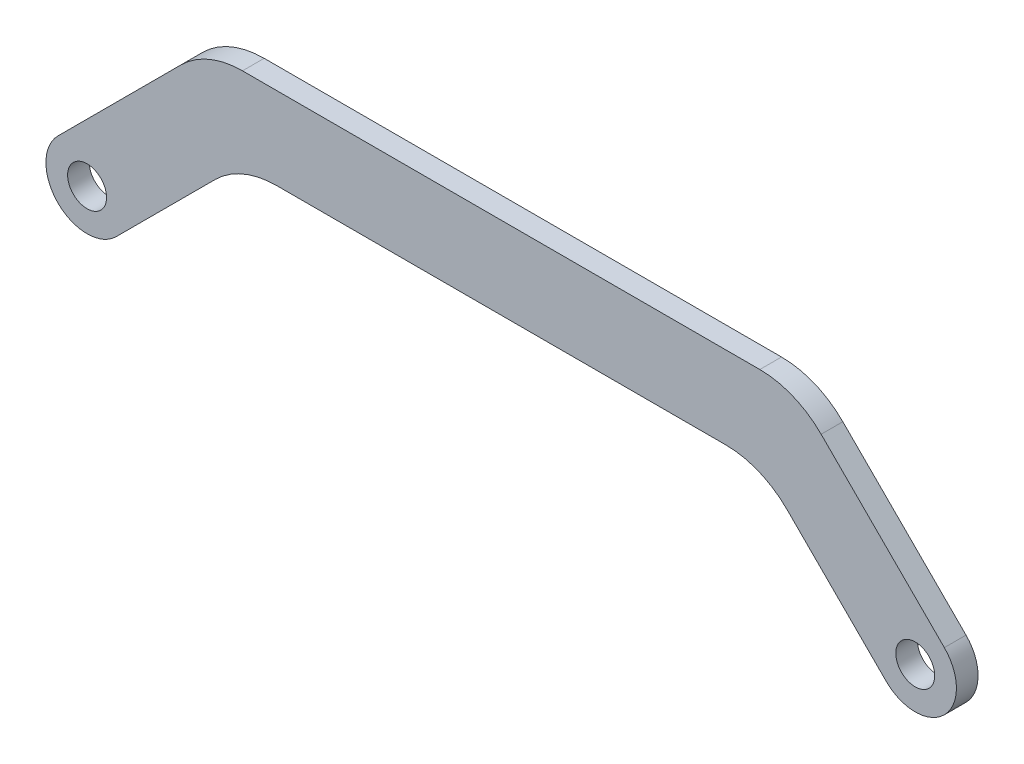
ISO-10303-21;
HEADER;
FILE_DESCRIPTION(('STEP AP214'),'2;1');
FILE_NAME('part.step','',(''),(''),'','','');
FILE_SCHEMA(('AUTOMOTIVE_DESIGN { 1 0 10303 214 1 1 1 1 }'));
ENDSEC;
DATA;
#1=APPLICATION_CONTEXT('core data for automotive mechanical design processes');
#2=APPLICATION_PROTOCOL_DEFINITION('international standard','automotive_design',2000,#1);
#3=PRODUCT_CONTEXT('',#1,'mechanical');
#4=PRODUCT('Part','Part','',(#3));
#5=PRODUCT_RELATED_PRODUCT_CATEGORY('part','',(#4));
#6=PRODUCT_DEFINITION_FORMATION('','',#4);
#7=PRODUCT_DEFINITION_CONTEXT('part definition',#1,'design');
#8=PRODUCT_DEFINITION('design','',#6,#7);
#9=PRODUCT_DEFINITION_SHAPE('','',#8);
#10=(LENGTH_UNIT() NAMED_UNIT(*) SI_UNIT(.MILLI.,.METRE.));
#11=(NAMED_UNIT(*) PLANE_ANGLE_UNIT() SI_UNIT($,.RADIAN.));
#12=(NAMED_UNIT(*) SI_UNIT($,.STERADIAN.) SOLID_ANGLE_UNIT());
#13=UNCERTAINTY_MEASURE_WITH_UNIT(LENGTH_MEASURE(1.E-05),#10,'distance_accuracy_value','');
#14=(GEOMETRIC_REPRESENTATION_CONTEXT(3) GLOBAL_UNCERTAINTY_ASSIGNED_CONTEXT((#13)) GLOBAL_UNIT_ASSIGNED_CONTEXT((#10,
#11,#12)) REPRESENTATION_CONTEXT('',''));
#15=CARTESIAN_POINT('',(0.,0.,0.));
#16=DIRECTION('',(0.,0.,1.));
#17=DIRECTION('',(1.,0.,0.));
#18=AXIS2_PLACEMENT_3D('',#15,#16,#17);
#19=CARTESIAN_POINT('',(0.,0.,5.));
#20=DIRECTION('',(0.,0.,1.));
#21=DIRECTION('',(1.,0.,0.));
#22=AXIS2_PLACEMENT_3D('',#19,#20,#21);
#23=PLANE('',#22);
#24=CARTESIAN_POINT('',(0.,0.,5.));
#25=DIRECTION('',(0.,0.,1.));
#26=DIRECTION('',(1.,0.,0.));
#27=AXIS2_PLACEMENT_3D('',#24,#25,#26);
#28=CIRCLE('',#27,4.49);
#29=CARTESIAN_POINT('',(4.49,0.,5.));
#30=VERTEX_POINT('',#29);
#31=EDGE_CURVE('E279',#30,#30,#28,.T.);
#32=ORIENTED_EDGE('',*,*,#31,.F.);
#33=EDGE_LOOP('',(#32));
#34=FACE_BOUND('',#33,.T.);
#35=DIRECTION('',(-0.707106781186546,0.707106781186549,0.));
#36=VECTOR('',#35,1.);
#37=CARTESIAN_POINT('',(197.71044335346,6.71044335346032,5.));
#38=LINE('',#37,#36);
#39=CARTESIAN_POINT('',(197.71044335346,6.71044335346032,5.));
#40=VERTEX_POINT('',#39);
#41=CARTESIAN_POINT('',(169.29875108319,35.1221356237309,5.));
#42=VERTEX_POINT('',#41);
#43=EDGE_CURVE('E256',#40,#42,#38,.T.);
#44=ORIENTED_EDGE('',*,*,#43,.T.);
#45=CARTESIAN_POINT('',(155.156615459459,20.98,5.));
#46=DIRECTION('',(0.,0.,1.));
#47=DIRECTION('',(1.,0.,0.));
#48=AXIS2_PLACEMENT_3D('',#45,#46,#47);
#49=CIRCLE('',#48,20.);
#50=CARTESIAN_POINT('',(155.156615459459,40.98,5.));
#51=VERTEX_POINT('',#50);
#52=EDGE_CURVE('E204',#42,#51,#49,.T.);
#53=ORIENTED_EDGE('',*,*,#52,.T.);
#54=DIRECTION('',(-1.,0.,0.));
#55=VECTOR('',#54,1.);
#56=CARTESIAN_POINT('',(27.5591132930792,40.98,5.));
#57=LINE('',#56,#55);
#58=CARTESIAN_POINT('',(35.8433845405411,40.98,5.));
#59=VERTEX_POINT('',#58);
#60=EDGE_CURVE('E266',#51,#59,#57,.T.);
#61=ORIENTED_EDGE('',*,*,#60,.T.);
#62=CARTESIAN_POINT('',(35.8433845405411,20.98,5.));
#63=DIRECTION('',(0.,0.,1.));
#64=DIRECTION('',(1.,0.,0.));
#65=AXIS2_PLACEMENT_3D('',#62,#63,#64);
#66=CIRCLE('',#65,20.);
#67=CARTESIAN_POINT('',(21.7012489168102,35.1221356237309,5.));
#68=VERTEX_POINT('',#67);
#69=EDGE_CURVE('E179',#59,#68,#66,.T.);
#70=ORIENTED_EDGE('',*,*,#69,.T.);
#71=DIRECTION('',(-0.707106781186546,-0.707106781186549,0.));
#72=VECTOR('',#71,1.);
#73=CARTESIAN_POINT('',(-6.71044335346035,6.71044335346032,5.));
#74=LINE('',#73,#72);
#75=CARTESIAN_POINT('',(-6.71044335346035,6.71044335346032,5.));
#76=VERTEX_POINT('',#75);
#77=EDGE_CURVE('E148',#68,#76,#74,.T.);
#78=ORIENTED_EDGE('',*,*,#77,.T.);
#79=CARTESIAN_POINT('',(0.,0.,5.));
#80=DIRECTION('',(0.,0.,1.));
#81=DIRECTION('',(1.,0.,0.));
#82=AXIS2_PLACEMENT_3D('',#79,#80,#81);
#83=CIRCLE('',#82,9.49);
#84=CARTESIAN_POINT('',(6.71044335346035,-6.71044335346032,5.));
#85=VERTEX_POINT('',#84);
#86=EDGE_CURVE('E142',#76,#85,#83,.T.);
#87=ORIENTED_EDGE('',*,*,#86,.T.);
#88=DIRECTION('',(0.707106781186546,0.707106781186549,0.));
#89=VECTOR('',#88,1.);
#90=CARTESIAN_POINT('',(6.71044335346035,-6.71044335346032,5.));
#91=LINE('',#90,#89);
#92=CARTESIAN_POINT('',(29.5630223306515,16.1421356237309,5.));
#93=VERTEX_POINT('',#92);
#94=EDGE_CURVE('E129',#85,#93,#91,.T.);
#95=ORIENTED_EDGE('',*,*,#94,.T.);
#96=CARTESIAN_POINT('',(43.7051579543825,2.,5.));
#97=DIRECTION('',(0.,0.,1.));
#98=DIRECTION('',(1.,0.,0.));
#99=AXIS2_PLACEMENT_3D('',#96,#97,#98);
#100=CIRCLE('',#99,20.);
#101=CARTESIAN_POINT('',(43.7051579543825,22.,5.));
#102=VERTEX_POINT('',#101);
#103=EDGE_CURVE('E191',#93,#102,#100,.F.);
#104=ORIENTED_EDGE('',*,*,#103,.T.);
#105=DIRECTION('',(1.,0.,0.));
#106=VECTOR('',#105,1.);
#107=CARTESIAN_POINT('',(35.4208867069206,22.,5.));
#108=LINE('',#107,#106);
#109=CARTESIAN_POINT('',(147.294842045618,22.,5.));
#110=VERTEX_POINT('',#109);
#111=EDGE_CURVE('E141',#102,#110,#108,.T.);
#112=ORIENTED_EDGE('',*,*,#111,.T.);
#113=CARTESIAN_POINT('',(147.294842045618,2.,5.));
#114=DIRECTION('',(0.,0.,1.));
#115=DIRECTION('',(1.,0.,0.));
#116=AXIS2_PLACEMENT_3D('',#113,#114,#115);
#117=CIRCLE('',#116,20.);
#118=CARTESIAN_POINT('',(161.436977669348,16.1421356237309,5.));
#119=VERTEX_POINT('',#118);
#120=EDGE_CURVE('E11',#110,#119,#117,.F.);
#121=ORIENTED_EDGE('',*,*,#120,.T.);
#122=DIRECTION('',(0.707106781186546,-0.707106781186549,0.));
#123=VECTOR('',#122,1.);
#124=CARTESIAN_POINT('',(184.28955664654,-6.71044335346032,5.));
#125=LINE('',#124,#123);
#126=CARTESIAN_POINT('',(184.28955664654,-6.71044335346031,5.));
#127=VERTEX_POINT('',#126);
#128=EDGE_CURVE('E219',#119,#127,#125,.T.);
#129=ORIENTED_EDGE('',*,*,#128,.T.);
#130=CARTESIAN_POINT('',(191.,0.,5.));
#131=DIRECTION('',(0.,0.,1.));
#132=DIRECTION('',(1.,0.,0.));
#133=AXIS2_PLACEMENT_3D('',#130,#131,#132);
#134=CIRCLE('',#133,9.48999999999999);
#135=EDGE_CURVE('E274',#127,#40,#134,.T.);
#136=ORIENTED_EDGE('',*,*,#135,.T.);
#137=EDGE_LOOP('',(#44,#53,#61,#70,#78,#87,#95,#104,#112,#121,#129,#136));
#138=FACE_BOUND('',#137,.T.);
#139=CARTESIAN_POINT('',(191.,0.,5.));
#140=DIRECTION('',(0.,0.,1.));
#141=DIRECTION('',(1.,0.,0.));
#142=AXIS2_PLACEMENT_3D('',#139,#140,#141);
#143=CIRCLE('',#142,4.48999999999998);
#144=CARTESIAN_POINT('',(195.49,0.,5.));
#145=VERTEX_POINT('',#144);
#146=EDGE_CURVE('E432',#145,#145,#143,.T.);
#147=ORIENTED_EDGE('',*,*,#146,.F.);
#148=EDGE_LOOP('',(#147));
#149=FACE_BOUND('',#148,.T.);
#150=ADVANCED_FACE('F39',(#34,#138,#149),#23,.T.);
#151=CARTESIAN_POINT('',(0.,0.,0.));
#152=DIRECTION('',(0.,0.,1.));
#153=DIRECTION('',(1.,0.,0.));
#154=AXIS2_PLACEMENT_3D('',#151,#152,#153);
#155=PLANE('',#154);
#156=DIRECTION('',(-1.,0.,0.));
#157=VECTOR('',#156,1.);
#158=CARTESIAN_POINT('',(27.5591132930792,40.98,0.));
#159=LINE('',#158,#157);
#160=CARTESIAN_POINT('',(155.156615459459,40.98,0.));
#161=VERTEX_POINT('',#160);
#162=CARTESIAN_POINT('',(35.8433845405411,40.98,0.));
#163=VERTEX_POINT('',#162);
#164=EDGE_CURVE('E242',#161,#163,#159,.T.);
#165=ORIENTED_EDGE('',*,*,#164,.F.);
#166=CARTESIAN_POINT('',(155.156615459459,20.98,0.));
#167=DIRECTION('',(0.,0.,1.));
#168=DIRECTION('',(1.,0.,0.));
#169=AXIS2_PLACEMENT_3D('',#166,#167,#168);
#170=CIRCLE('',#169,20.);
#171=CARTESIAN_POINT('',(169.29875108319,35.1221356237309,0.));
#172=VERTEX_POINT('',#171);
#173=EDGE_CURVE('E198',#161,#172,#170,.F.);
#174=ORIENTED_EDGE('',*,*,#173,.T.);
#175=DIRECTION('',(-0.707106781186546,0.707106781186549,0.));
#176=VECTOR('',#175,1.);
#177=CARTESIAN_POINT('',(197.71044335346,6.71044335346032,0.));
#178=LINE('',#177,#176);
#179=CARTESIAN_POINT('',(197.71044335346,6.71044335346032,0.));
#180=VERTEX_POINT('',#179);
#181=EDGE_CURVE('E233',#180,#172,#178,.T.);
#182=ORIENTED_EDGE('',*,*,#181,.F.);
#183=CARTESIAN_POINT('',(191.,0.,0.));
#184=DIRECTION('',(0.,0.,1.));
#185=DIRECTION('',(1.,0.,0.));
#186=AXIS2_PLACEMENT_3D('',#183,#184,#185);
#187=CIRCLE('',#186,9.48999999999999);
#188=CARTESIAN_POINT('',(184.28955664654,-6.71044335346031,0.));
#189=VERTEX_POINT('',#188);
#190=EDGE_CURVE('E227',#189,#180,#187,.T.);
#191=ORIENTED_EDGE('',*,*,#190,.F.);
#192=DIRECTION('',(0.707106781186546,-0.707106781186549,0.));
#193=VECTOR('',#192,1.);
#194=CARTESIAN_POINT('',(184.28955664654,-6.71044335346032,0.));
#195=LINE('',#194,#193);
#196=CARTESIAN_POINT('',(161.436977669348,16.1421356237309,0.));
#197=VERTEX_POINT('',#196);
#198=EDGE_CURVE('E218',#197,#189,#195,.T.);
#199=ORIENTED_EDGE('',*,*,#198,.F.);
#200=CARTESIAN_POINT('',(147.294842045618,2.,0.));
#201=DIRECTION('',(0.,0.,1.));
#202=DIRECTION('',(1.,0.,0.));
#203=AXIS2_PLACEMENT_3D('',#200,#201,#202);
#204=CIRCLE('',#203,20.);
#205=CARTESIAN_POINT('',(147.294842045618,22.,0.));
#206=VERTEX_POINT('',#205);
#207=EDGE_CURVE('E48',#197,#206,#204,.T.);
#208=ORIENTED_EDGE('',*,*,#207,.T.);
#209=DIRECTION('',(1.,0.,0.));
#210=VECTOR('',#209,1.);
#211=CARTESIAN_POINT('',(35.4208867069206,22.,0.));
#212=LINE('',#211,#210);
#213=CARTESIAN_POINT('',(43.7051579543825,22.,0.));
#214=VERTEX_POINT('',#213);
#215=EDGE_CURVE('E229',#214,#206,#212,.T.);
#216=ORIENTED_EDGE('',*,*,#215,.F.);
#217=CARTESIAN_POINT('',(43.7051579543825,2.,0.));
#218=DIRECTION('',(0.,0.,1.));
#219=DIRECTION('',(1.,0.,0.));
#220=AXIS2_PLACEMENT_3D('',#217,#218,#219);
#221=CIRCLE('',#220,20.);
#222=CARTESIAN_POINT('',(29.5630223306515,16.1421356237309,0.));
#223=VERTEX_POINT('',#222);
#224=EDGE_CURVE('E188',#214,#223,#221,.T.);
#225=ORIENTED_EDGE('',*,*,#224,.T.);
#226=DIRECTION('',(0.707106781186546,0.707106781186549,0.));
#227=VECTOR('',#226,1.);
#228=CARTESIAN_POINT('',(6.71044335346035,-6.71044335346032,0.));
#229=LINE('',#228,#227);
#230=CARTESIAN_POINT('',(6.71044335346035,-6.71044335346032,0.));
#231=VERTEX_POINT('',#230);
#232=EDGE_CURVE('E235',#231,#223,#229,.T.);
#233=ORIENTED_EDGE('',*,*,#232,.F.);
#234=CARTESIAN_POINT('',(0.,0.,0.));
#235=DIRECTION('',(0.,0.,1.));
#236=DIRECTION('',(1.,0.,0.));
#237=AXIS2_PLACEMENT_3D('',#234,#235,#236);
#238=CIRCLE('',#237,9.49);
#239=CARTESIAN_POINT('',(-6.71044335346035,6.71044335346032,0.));
#240=VERTEX_POINT('',#239);
#241=EDGE_CURVE('E157',#240,#231,#238,.T.);
#242=ORIENTED_EDGE('',*,*,#241,.F.);
#243=DIRECTION('',(-0.707106781186546,-0.707106781186549,0.));
#244=VECTOR('',#243,1.);
#245=CARTESIAN_POINT('',(-6.71044335346035,6.71044335346032,0.));
#246=LINE('',#245,#244);
#247=CARTESIAN_POINT('',(21.7012489168102,35.1221356237309,0.));
#248=VERTEX_POINT('',#247);
#249=EDGE_CURVE('E153',#248,#240,#246,.T.);
#250=ORIENTED_EDGE('',*,*,#249,.F.);
#251=CARTESIAN_POINT('',(35.8433845405411,20.98,0.));
#252=DIRECTION('',(0.,0.,1.));
#253=DIRECTION('',(1.,0.,0.));
#254=AXIS2_PLACEMENT_3D('',#251,#252,#253);
#255=CIRCLE('',#254,20.);
#256=EDGE_CURVE('E165',#248,#163,#255,.F.);
#257=ORIENTED_EDGE('',*,*,#256,.T.);
#258=EDGE_LOOP('',(#165,#174,#182,#191,#199,#208,#216,#225,#233,#242,#250,#257));
#259=FACE_BOUND('',#258,.T.);
#260=CARTESIAN_POINT('',(0.,0.,0.));
#261=DIRECTION('',(0.,0.,1.));
#262=DIRECTION('',(1.,0.,0.));
#263=AXIS2_PLACEMENT_3D('',#260,#261,#262);
#264=CIRCLE('',#263,4.49);
#265=CARTESIAN_POINT('',(4.49,0.,0.));
#266=VERTEX_POINT('',#265);
#267=EDGE_CURVE('E440',#266,#266,#264,.T.);
#268=ORIENTED_EDGE('',*,*,#267,.T.);
#269=EDGE_LOOP('',(#268));
#270=FACE_BOUND('',#269,.T.);
#271=CARTESIAN_POINT('',(191.,0.,0.));
#272=DIRECTION('',(0.,0.,1.));
#273=DIRECTION('',(1.,0.,0.));
#274=AXIS2_PLACEMENT_3D('',#271,#272,#273);
#275=CIRCLE('',#274,4.48999999999998);
#276=CARTESIAN_POINT('',(195.49,0.,0.));
#277=VERTEX_POINT('',#276);
#278=EDGE_CURVE('E435',#277,#277,#275,.T.);
#279=ORIENTED_EDGE('',*,*,#278,.T.);
#280=EDGE_LOOP('',(#279));
#281=FACE_BOUND('',#280,.T.);
#282=ADVANCED_FACE('F224',(#259,#270,#281),#155,.F.);
#283=CARTESIAN_POINT('',(0.,0.,5.));
#284=DIRECTION('',(0.,0.,-1.));
#285=DIRECTION('',(-1.,0.,0.));
#286=AXIS2_PLACEMENT_3D('',#283,#284,#285);
#287=CYLINDRICAL_SURFACE('',#286,9.49);
#288=ORIENTED_EDGE('',*,*,#241,.T.);
#289=DIRECTION('',(0.,0.,-1.));
#290=VECTOR('',#289,1.);
#291=CARTESIAN_POINT('',(6.71044335346035,-6.71044335346032,5.));
#292=LINE('',#291,#290);
#293=EDGE_CURVE('E134',#85,#231,#292,.T.);
#294=ORIENTED_EDGE('',*,*,#293,.F.);
#295=ORIENTED_EDGE('',*,*,#86,.F.);
#296=DIRECTION('',(0.,0.,-1.));
#297=VECTOR('',#296,1.);
#298=CARTESIAN_POINT('',(-6.71044335346035,6.71044335346032,5.));
#299=LINE('',#298,#297);
#300=EDGE_CURVE('E247',#76,#240,#299,.T.);
#301=ORIENTED_EDGE('',*,*,#300,.T.);
#302=EDGE_LOOP('',(#288,#294,#295,#301));
#303=FACE_BOUND('',#302,.T.);
#304=ADVANCED_FACE('F155',(#303),#287,.T.);
#305=CARTESIAN_POINT('',(6.71044335346035,-6.71044335346032,5.));
#306=DIRECTION('',(-0.707106781186549,0.707106781186546,0.));
#307=DIRECTION('',(-0.707106781186546,-0.707106781186549,0.));
#308=AXIS2_PLACEMENT_3D('',#305,#306,#307);
#309=PLANE('',#308);
#310=ORIENTED_EDGE('',*,*,#232,.T.);
#311=DIRECTION('',(0.,0.,-1.));
#312=VECTOR('',#311,1.);
#313=CARTESIAN_POINT('',(29.5630223306515,16.1421356237309,5.));
#314=LINE('',#313,#312);
#315=EDGE_CURVE('E137',#223,#93,#314,.F.);
#316=ORIENTED_EDGE('',*,*,#315,.T.);
#317=ORIENTED_EDGE('',*,*,#94,.F.);
#318=ORIENTED_EDGE('',*,*,#293,.T.);
#319=EDGE_LOOP('',(#310,#316,#317,#318));
#320=FACE_BOUND('',#319,.T.);
#321=ADVANCED_FACE('F132',(#320),#309,.F.);
#322=CARTESIAN_POINT('',(35.4208867069206,22.,5.));
#323=DIRECTION('',(0.,1.,0.));
#324=DIRECTION('',(0.,0.,1.));
#325=AXIS2_PLACEMENT_3D('',#322,#323,#324);
#326=PLANE('',#325);
#327=ORIENTED_EDGE('',*,*,#215,.T.);
#328=DIRECTION('',(0.,0.,-1.));
#329=VECTOR('',#328,1.);
#330=CARTESIAN_POINT('',(147.294842045618,22.,5.));
#331=LINE('',#330,#329);
#332=EDGE_CURVE('E61',#206,#110,#331,.F.);
#333=ORIENTED_EDGE('',*,*,#332,.T.);
#334=ORIENTED_EDGE('',*,*,#111,.F.);
#335=DIRECTION('',(0.,0.,-1.));
#336=VECTOR('',#335,1.);
#337=CARTESIAN_POINT('',(43.7051579543825,22.,0.));
#338=LINE('',#337,#336);
#339=EDGE_CURVE('E182',#102,#214,#338,.T.);
#340=ORIENTED_EDGE('',*,*,#339,.T.);
#341=EDGE_LOOP('',(#327,#333,#334,#340));
#342=FACE_BOUND('',#341,.T.);
#343=ADVANCED_FACE('F284',(#342),#326,.F.);
#344=CARTESIAN_POINT('',(184.28955664654,-6.71044335346032,5.));
#345=DIRECTION('',(0.707106781186549,0.707106781186546,0.));
#346=DIRECTION('',(-0.707106781186546,0.707106781186549,0.));
#347=AXIS2_PLACEMENT_3D('',#344,#345,#346);
#348=PLANE('',#347);
#349=ORIENTED_EDGE('',*,*,#128,.F.);
#350=DIRECTION('',(0.,0.,-1.));
#351=VECTOR('',#350,1.);
#352=CARTESIAN_POINT('',(161.436977669348,16.1421356237309,0.));
#353=LINE('',#352,#351);
#354=EDGE_CURVE('E207',#119,#197,#353,.T.);
#355=ORIENTED_EDGE('',*,*,#354,.T.);
#356=ORIENTED_EDGE('',*,*,#198,.T.);
#357=DIRECTION('',(0.,0.,-1.));
#358=VECTOR('',#357,1.);
#359=CARTESIAN_POINT('',(184.28955664654,-6.71044335346031,5.));
#360=LINE('',#359,#358);
#361=EDGE_CURVE('E160',#127,#189,#360,.T.);
#362=ORIENTED_EDGE('',*,*,#361,.F.);
#363=EDGE_LOOP('',(#349,#355,#356,#362));
#364=FACE_BOUND('',#363,.T.);
#365=ADVANCED_FACE('F216',(#364),#348,.F.);
#366=CARTESIAN_POINT('',(191.,0.,5.));
#367=DIRECTION('',(0.,0.,-1.));
#368=DIRECTION('',(-1.,0.,0.));
#369=AXIS2_PLACEMENT_3D('',#366,#367,#368);
#370=CYLINDRICAL_SURFACE('',#369,9.48999999999999);
#371=ORIENTED_EDGE('',*,*,#190,.T.);
#372=DIRECTION('',(0.,0.,-1.));
#373=VECTOR('',#372,1.);
#374=CARTESIAN_POINT('',(197.71044335346,6.71044335346032,5.));
#375=LINE('',#374,#373);
#376=EDGE_CURVE('E168',#40,#180,#375,.T.);
#377=ORIENTED_EDGE('',*,*,#376,.F.);
#378=ORIENTED_EDGE('',*,*,#135,.F.);
#379=ORIENTED_EDGE('',*,*,#361,.T.);
#380=EDGE_LOOP('',(#371,#377,#378,#379));
#381=FACE_BOUND('',#380,.T.);
#382=ADVANCED_FACE('F290',(#381),#370,.T.);
#383=CARTESIAN_POINT('',(197.71044335346,6.71044335346032,5.));
#384=DIRECTION('',(-0.707106781186549,-0.707106781186546,0.));
#385=DIRECTION('',(0.707106781186546,-0.707106781186549,0.));
#386=AXIS2_PLACEMENT_3D('',#383,#384,#385);
#387=PLANE('',#386);
#388=ORIENTED_EDGE('',*,*,#181,.T.);
#389=DIRECTION('',(0.,0.,-1.));
#390=VECTOR('',#389,1.);
#391=CARTESIAN_POINT('',(169.29875108319,35.1221356237309,5.));
#392=LINE('',#391,#390);
#393=EDGE_CURVE('E201',#172,#42,#392,.F.);
#394=ORIENTED_EDGE('',*,*,#393,.T.);
#395=ORIENTED_EDGE('',*,*,#43,.F.);
#396=ORIENTED_EDGE('',*,*,#376,.T.);
#397=EDGE_LOOP('',(#388,#394,#395,#396));
#398=FACE_BOUND('',#397,.T.);
#399=ADVANCED_FACE('F254',(#398),#387,.F.);
#400=CARTESIAN_POINT('',(27.5591132930792,40.98,5.));
#401=DIRECTION('',(0.,-1.,0.));
#402=DIRECTION('',(0.,0.,-1.));
#403=AXIS2_PLACEMENT_3D('',#400,#401,#402);
#404=PLANE('',#403);
#405=ORIENTED_EDGE('',*,*,#60,.F.);
#406=DIRECTION('',(0.,0.,-1.));
#407=VECTOR('',#406,1.);
#408=CARTESIAN_POINT('',(155.156615459459,40.98,5.));
#409=LINE('',#408,#407);
#410=EDGE_CURVE('E194',#51,#161,#409,.T.);
#411=ORIENTED_EDGE('',*,*,#410,.T.);
#412=ORIENTED_EDGE('',*,*,#164,.T.);
#413=DIRECTION('',(0.,0.,-1.));
#414=VECTOR('',#413,1.);
#415=CARTESIAN_POINT('',(35.8433845405411,40.98,5.));
#416=LINE('',#415,#414);
#417=EDGE_CURVE('E175',#163,#59,#416,.F.);
#418=ORIENTED_EDGE('',*,*,#417,.T.);
#419=EDGE_LOOP('',(#405,#411,#412,#418));
#420=FACE_BOUND('',#419,.T.);
#421=ADVANCED_FACE('F265',(#420),#404,.F.);
#422=CARTESIAN_POINT('',(-6.71044335346035,6.71044335346032,5.));
#423=DIRECTION('',(0.707106781186549,-0.707106781186546,0.));
#424=DIRECTION('',(0.707106781186546,0.707106781186549,0.));
#425=AXIS2_PLACEMENT_3D('',#422,#423,#424);
#426=PLANE('',#425);
#427=ORIENTED_EDGE('',*,*,#77,.F.);
#428=DIRECTION('',(0.,0.,-1.));
#429=VECTOR('',#428,1.);
#430=CARTESIAN_POINT('',(21.7012489168102,35.1221356237309,5.));
#431=LINE('',#430,#429);
#432=EDGE_CURVE('E159',#68,#248,#431,.T.);
#433=ORIENTED_EDGE('',*,*,#432,.T.);
#434=ORIENTED_EDGE('',*,*,#249,.T.);
#435=ORIENTED_EDGE('',*,*,#300,.F.);
#436=EDGE_LOOP('',(#427,#433,#434,#435));
#437=FACE_BOUND('',#436,.T.);
#438=ADVANCED_FACE('F311',(#437),#426,.F.);
#439=CARTESIAN_POINT('',(0.,0.,5.));
#440=DIRECTION('',(0.,0.,-1.));
#441=DIRECTION('',(-1.,0.,0.));
#442=AXIS2_PLACEMENT_3D('',#439,#440,#441);
#443=CYLINDRICAL_SURFACE('',#442,4.49);
#444=ORIENTED_EDGE('',*,*,#31,.T.);
#445=EDGE_LOOP('',(#444));
#446=FACE_BOUND('',#445,.T.);
#447=ORIENTED_EDGE('',*,*,#267,.F.);
#448=EDGE_LOOP('',(#447));
#449=FACE_BOUND('',#448,.T.);
#450=ADVANCED_FACE('F308',(#446,#449),#443,.F.);
#451=CARTESIAN_POINT('',(191.,0.,5.));
#452=DIRECTION('',(0.,0.,-1.));
#453=DIRECTION('',(-1.,0.,0.));
#454=AXIS2_PLACEMENT_3D('',#451,#452,#453);
#455=CYLINDRICAL_SURFACE('',#454,4.48999999999998);
#456=ORIENTED_EDGE('',*,*,#146,.T.);
#457=EDGE_LOOP('',(#456));
#458=FACE_BOUND('',#457,.T.);
#459=ORIENTED_EDGE('',*,*,#278,.F.);
#460=EDGE_LOOP('',(#459));
#461=FACE_BOUND('',#460,.T.);
#462=ADVANCED_FACE('F333',(#458,#461),#455,.F.);
#463=CARTESIAN_POINT('',(35.8433845405411,20.98,5.));
#464=DIRECTION('',(0.,0.,-1.));
#465=DIRECTION('',(-1.,0.,0.));
#466=AXIS2_PLACEMENT_3D('',#463,#464,#465);
#467=CYLINDRICAL_SURFACE('',#466,20.);
#468=ORIENTED_EDGE('',*,*,#69,.F.);
#469=ORIENTED_EDGE('',*,*,#417,.F.);
#470=ORIENTED_EDGE('',*,*,#256,.F.);
#471=ORIENTED_EDGE('',*,*,#432,.F.);
#472=EDGE_LOOP('',(#468,#469,#470,#471));
#473=FACE_BOUND('',#472,.T.);
#474=ADVANCED_FACE('F339',(#473),#467,.T.);
#475=CARTESIAN_POINT('',(43.7051579543825,2.,5.));
#476=DIRECTION('',(0.,0.,1.));
#477=DIRECTION('',(1.,0.,0.));
#478=AXIS2_PLACEMENT_3D('',#475,#476,#477);
#479=CYLINDRICAL_SURFACE('',#478,20.);
#480=ORIENTED_EDGE('',*,*,#103,.F.);
#481=ORIENTED_EDGE('',*,*,#315,.F.);
#482=ORIENTED_EDGE('',*,*,#224,.F.);
#483=ORIENTED_EDGE('',*,*,#339,.F.);
#484=EDGE_LOOP('',(#480,#481,#482,#483));
#485=FACE_BOUND('',#484,.T.);
#486=ADVANCED_FACE('F282',(#485),#479,.F.);
#487=CARTESIAN_POINT('',(155.156615459459,20.98,5.));
#488=DIRECTION('',(0.,0.,-1.));
#489=DIRECTION('',(-1.,0.,0.));
#490=AXIS2_PLACEMENT_3D('',#487,#488,#489);
#491=CYLINDRICAL_SURFACE('',#490,20.);
#492=ORIENTED_EDGE('',*,*,#52,.F.);
#493=ORIENTED_EDGE('',*,*,#393,.F.);
#494=ORIENTED_EDGE('',*,*,#173,.F.);
#495=ORIENTED_EDGE('',*,*,#410,.F.);
#496=EDGE_LOOP('',(#492,#493,#494,#495));
#497=FACE_BOUND('',#496,.T.);
#498=ADVANCED_FACE('F262',(#497),#491,.T.);
#499=CARTESIAN_POINT('',(147.294842045618,2.,5.));
#500=DIRECTION('',(0.,0.,1.));
#501=DIRECTION('',(1.,0.,0.));
#502=AXIS2_PLACEMENT_3D('',#499,#500,#501);
#503=CYLINDRICAL_SURFACE('',#502,20.);
#504=ORIENTED_EDGE('',*,*,#120,.F.);
#505=ORIENTED_EDGE('',*,*,#332,.F.);
#506=ORIENTED_EDGE('',*,*,#207,.F.);
#507=ORIENTED_EDGE('',*,*,#354,.F.);
#508=EDGE_LOOP('',(#504,#505,#506,#507));
#509=FACE_BOUND('',#508,.T.);
#510=ADVANCED_FACE('F41',(#509),#503,.F.);
#511=CLOSED_SHELL('',(#150,#282,#304,#321,#343,#365,#382,#399,#421,#438,#450,#462,#474,#486,
#498,#510));
#512=MANIFOLD_SOLID_BREP('B2',#511);
#513=ADVANCED_BREP_SHAPE_REPRESENTATION('',(#18,#512),#14);
#514=SHAPE_DEFINITION_REPRESENTATION(#9,#513);
ENDSEC;
END-ISO-10303-21;
